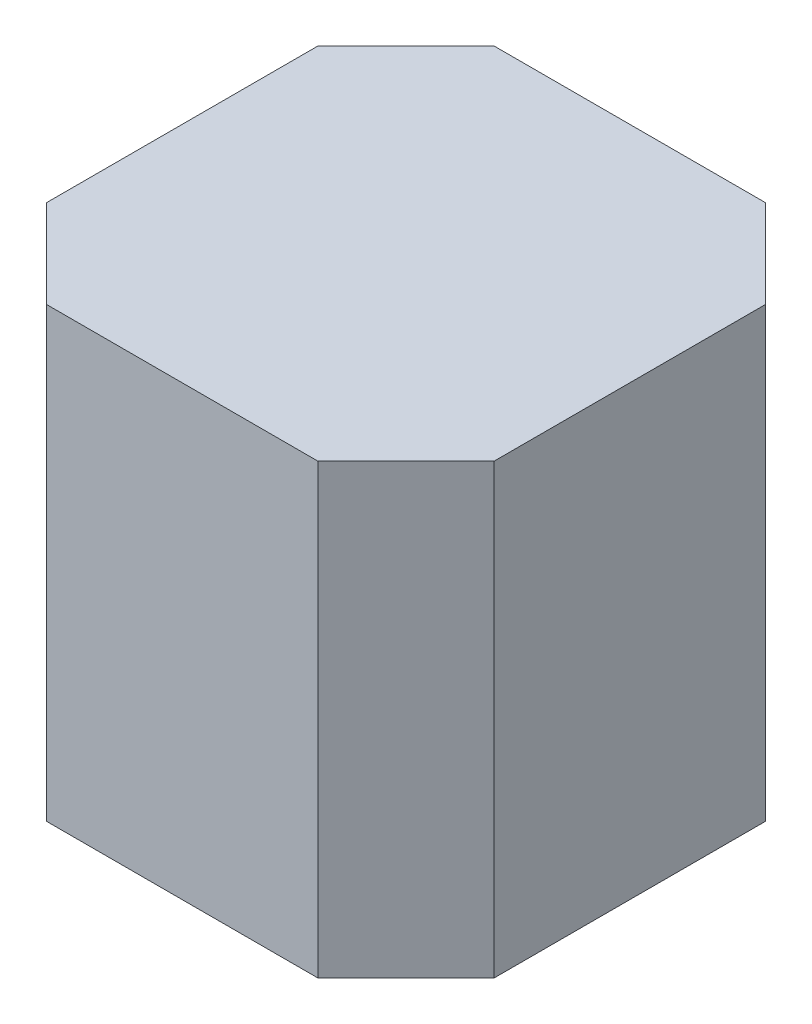
ISO-10303-21;
HEADER;
FILE_DESCRIPTION(('STEP AP214'),'2;1');
FILE_NAME('part.step','',(''),(''),'','','');
FILE_SCHEMA(('AUTOMOTIVE_DESIGN { 1 0 10303 214 1 1 1 1 }'));
ENDSEC;
DATA;
#1=APPLICATION_CONTEXT('core data for automotive mechanical design processes');
#2=APPLICATION_PROTOCOL_DEFINITION('international standard','automotive_design',2000,#1);
#3=PRODUCT_CONTEXT('',#1,'mechanical');
#4=PRODUCT('Part','Part','',(#3));
#5=PRODUCT_RELATED_PRODUCT_CATEGORY('part','',(#4));
#6=PRODUCT_DEFINITION_FORMATION('','',#4);
#7=PRODUCT_DEFINITION_CONTEXT('part definition',#1,'design');
#8=PRODUCT_DEFINITION('design','',#6,#7);
#9=PRODUCT_DEFINITION_SHAPE('','',#8);
#10=(LENGTH_UNIT() NAMED_UNIT(*) SI_UNIT(.MILLI.,.METRE.));
#11=(NAMED_UNIT(*) PLANE_ANGLE_UNIT() SI_UNIT($,.RADIAN.));
#12=(NAMED_UNIT(*) SI_UNIT($,.STERADIAN.) SOLID_ANGLE_UNIT());
#13=UNCERTAINTY_MEASURE_WITH_UNIT(LENGTH_MEASURE(1.E-05),#10,'distance_accuracy_value','');
#14=(GEOMETRIC_REPRESENTATION_CONTEXT(3) GLOBAL_UNCERTAINTY_ASSIGNED_CONTEXT((#13)) GLOBAL_UNIT_ASSIGNED_CONTEXT((#10,
#11,#12)) REPRESENTATION_CONTEXT('',''));
#15=CARTESIAN_POINT('',(0.,0.,0.));
#16=DIRECTION('',(0.,0.,1.));
#17=DIRECTION('',(1.,0.,0.));
#18=AXIS2_PLACEMENT_3D('',#15,#16,#17);
#19=CARTESIAN_POINT('',(2.54,0.,-1.27));
#20=DIRECTION('',(-1.,0.,0.));
#21=DIRECTION('',(0.,0.,1.));
#22=AXIS2_PLACEMENT_3D('',#19,#20,#21);
#23=PLANE('',#22);
#24=DIRECTION('',(0.,1.,0.));
#25=VECTOR('',#24,1.);
#26=CARTESIAN_POINT('',(2.54,0.,-0.77));
#27=LINE('',#26,#25);
#28=CARTESIAN_POINT('',(2.54,0.,-0.77));
#29=VERTEX_POINT('',#28);
#30=CARTESIAN_POINT('',(2.54,2.54,-0.77));
#31=VERTEX_POINT('',#30);
#32=EDGE_CURVE('E97',#29,#31,#27,.T.);
#33=ORIENTED_EDGE('',*,*,#32,.F.);
#34=DIRECTION('',(0.,0.,1.));
#35=VECTOR('',#34,1.);
#36=CARTESIAN_POINT('',(2.54,0.,-1.27));
#37=LINE('',#36,#35);
#38=CARTESIAN_POINT('',(2.54,0.,0.77));
#39=VERTEX_POINT('',#38);
#40=EDGE_CURVE('E83',#29,#39,#37,.T.);
#41=ORIENTED_EDGE('',*,*,#40,.T.);
#42=DIRECTION('',(0.,1.,0.));
#43=VECTOR('',#42,1.);
#44=CARTESIAN_POINT('',(2.54,0.,0.77));
#45=LINE('',#44,#43);
#46=CARTESIAN_POINT('',(2.54,2.54,0.77));
#47=VERTEX_POINT('',#46);
#48=EDGE_CURVE('E94',#47,#39,#45,.F.);
#49=ORIENTED_EDGE('',*,*,#48,.F.);
#50=DIRECTION('',(0.,0.,1.));
#51=VECTOR('',#50,1.);
#52=CARTESIAN_POINT('',(2.54,2.54,-1.27));
#53=LINE('',#52,#51);
#54=EDGE_CURVE('E20',#47,#31,#53,.F.);
#55=ORIENTED_EDGE('',*,*,#54,.T.);
#56=EDGE_LOOP('',(#33,#41,#49,#55));
#57=FACE_BOUND('',#56,.T.);
#58=ADVANCED_FACE('F17',(#57),#23,.T.);
#59=CARTESIAN_POINT('',(2.79,0.,1.02));
#60=DIRECTION('',(-0.707106781186548,0.,0.707106781186548));
#61=DIRECTION('',(0.707106781186548,0.,0.707106781186548));
#62=AXIS2_PLACEMENT_3D('',#59,#60,#61);
#63=PLANE('',#62);
#64=DIRECTION('',(0.707106781186548,0.,0.707106781186548));
#65=VECTOR('',#64,1.);
#66=CARTESIAN_POINT('',(2.79,2.54,1.02));
#67=LINE('',#66,#65);
#68=CARTESIAN_POINT('',(3.04,2.54,1.27));
#69=VERTEX_POINT('',#68);
#70=EDGE_CURVE('E91',#69,#47,#67,.F.);
#71=ORIENTED_EDGE('',*,*,#70,.T.);
#72=ORIENTED_EDGE('',*,*,#48,.T.);
#73=DIRECTION('',(0.707106781186548,0.,0.707106781186548));
#74=VECTOR('',#73,1.);
#75=CARTESIAN_POINT('',(2.79,0.,1.02));
#76=LINE('',#75,#74);
#77=CARTESIAN_POINT('',(3.04,0.,1.27));
#78=VERTEX_POINT('',#77);
#79=EDGE_CURVE('E80',#39,#78,#76,.T.);
#80=ORIENTED_EDGE('',*,*,#79,.T.);
#81=DIRECTION('',(0.,1.,0.));
#82=VECTOR('',#81,1.);
#83=CARTESIAN_POINT('',(3.04,0.,1.27));
#84=LINE('',#83,#82);
#85=EDGE_CURVE('E111',#69,#78,#84,.F.);
#86=ORIENTED_EDGE('',*,*,#85,.F.);
#87=EDGE_LOOP('',(#71,#72,#80,#86));
#88=FACE_BOUND('',#87,.T.);
#89=ADVANCED_FACE('F99',(#88),#63,.T.);
#90=CARTESIAN_POINT('',(2.79,0.,-1.02));
#91=DIRECTION('',(-0.707106781186548,0.,-0.707106781186548));
#92=DIRECTION('',(-0.707106781186548,0.,0.707106781186548));
#93=AXIS2_PLACEMENT_3D('',#90,#91,#92);
#94=PLANE('',#93);
#95=DIRECTION('',(-0.707106781186548,0.,0.707106781186548));
#96=VECTOR('',#95,1.);
#97=CARTESIAN_POINT('',(2.79,2.54,-1.02));
#98=LINE('',#97,#96);
#99=CARTESIAN_POINT('',(3.04,2.54,-1.27));
#100=VERTEX_POINT('',#99);
#101=EDGE_CURVE('E106',#31,#100,#98,.F.);
#102=ORIENTED_EDGE('',*,*,#101,.T.);
#103=DIRECTION('',(0.,1.,0.));
#104=VECTOR('',#103,1.);
#105=CARTESIAN_POINT('',(3.04,0.,-1.27));
#106=LINE('',#105,#104);
#107=CARTESIAN_POINT('',(3.04,0.,-1.27));
#108=VERTEX_POINT('',#107);
#109=EDGE_CURVE('E114',#108,#100,#106,.T.);
#110=ORIENTED_EDGE('',*,*,#109,.F.);
#111=DIRECTION('',(-0.707106781186548,0.,0.707106781186548));
#112=VECTOR('',#111,1.);
#113=CARTESIAN_POINT('',(2.79,0.,-1.02));
#114=LINE('',#113,#112);
#115=EDGE_CURVE('E100',#108,#29,#114,.T.);
#116=ORIENTED_EDGE('',*,*,#115,.T.);
#117=ORIENTED_EDGE('',*,*,#32,.T.);
#118=EDGE_LOOP('',(#102,#110,#116,#117));
#119=FACE_BOUND('',#118,.T.);
#120=ADVANCED_FACE('F158',(#119),#94,.T.);
#121=CARTESIAN_POINT('',(2.54,0.,1.27));
#122=DIRECTION('',(0.,0.,1.));
#123=DIRECTION('',(1.,0.,0.));
#124=AXIS2_PLACEMENT_3D('',#121,#122,#123);
#125=PLANE('',#124);
#126=ORIENTED_EDGE('',*,*,#85,.T.);
#127=DIRECTION('',(1.,0.,0.));
#128=VECTOR('',#127,1.);
#129=CARTESIAN_POINT('',(2.54,0.,1.27));
#130=LINE('',#129,#128);
#131=CARTESIAN_POINT('',(4.58,0.,1.27));
#132=VERTEX_POINT('',#131);
#133=EDGE_CURVE('E86',#78,#132,#130,.T.);
#134=ORIENTED_EDGE('',*,*,#133,.T.);
#135=DIRECTION('',(0.,1.,0.));
#136=VECTOR('',#135,1.);
#137=CARTESIAN_POINT('',(4.58,0.,1.27));
#138=LINE('',#137,#136);
#139=CARTESIAN_POINT('',(4.58,2.54,1.27));
#140=VERTEX_POINT('',#139);
#141=EDGE_CURVE('E120',#140,#132,#138,.F.);
#142=ORIENTED_EDGE('',*,*,#141,.F.);
#143=DIRECTION('',(1.,0.,0.));
#144=VECTOR('',#143,1.);
#145=CARTESIAN_POINT('',(2.54,2.54,1.27));
#146=LINE('',#145,#144);
#147=EDGE_CURVE('E108',#140,#69,#146,.F.);
#148=ORIENTED_EDGE('',*,*,#147,.T.);
#149=EDGE_LOOP('',(#126,#134,#142,#148));
#150=FACE_BOUND('',#149,.T.);
#151=ADVANCED_FACE('F163',(#150),#125,.T.);
#152=CARTESIAN_POINT('',(5.08,0.,-1.27));
#153=DIRECTION('',(0.,0.,-1.));
#154=DIRECTION('',(-1.,0.,0.));
#155=AXIS2_PLACEMENT_3D('',#152,#153,#154);
#156=PLANE('',#155);
#157=ORIENTED_EDGE('',*,*,#109,.T.);
#158=DIRECTION('',(-1.,0.,0.));
#159=VECTOR('',#158,1.);
#160=CARTESIAN_POINT('',(5.08,2.54,-1.27));
#161=LINE('',#160,#159);
#162=CARTESIAN_POINT('',(4.58,2.54,-1.27));
#163=VERTEX_POINT('',#162);
#164=EDGE_CURVE('E117',#100,#163,#161,.F.);
#165=ORIENTED_EDGE('',*,*,#164,.T.);
#166=DIRECTION('',(0.,1.,0.));
#167=VECTOR('',#166,1.);
#168=CARTESIAN_POINT('',(4.58,0.,-1.27));
#169=LINE('',#168,#167);
#170=CARTESIAN_POINT('',(4.58,0.,-1.27));
#171=VERTEX_POINT('',#170);
#172=EDGE_CURVE('E131',#171,#163,#169,.T.);
#173=ORIENTED_EDGE('',*,*,#172,.F.);
#174=DIRECTION('',(1.,0.,0.));
#175=VECTOR('',#174,1.);
#176=CARTESIAN_POINT('',(3.81,0.,-1.27));
#177=LINE('',#176,#175);
#178=EDGE_CURVE('E125',#171,#108,#177,.F.);
#179=ORIENTED_EDGE('',*,*,#178,.T.);
#180=EDGE_LOOP('',(#157,#165,#173,#179));
#181=FACE_BOUND('',#180,.T.);
#182=ADVANCED_FACE('F155',(#181),#156,.T.);
#183=CARTESIAN_POINT('',(4.83,0.,1.02));
#184=DIRECTION('',(0.707106781186548,0.,0.707106781186548));
#185=DIRECTION('',(0.707106781186548,0.,-0.707106781186548));
#186=AXIS2_PLACEMENT_3D('',#183,#184,#185);
#187=PLANE('',#186);
#188=DIRECTION('',(0.707106781186548,0.,-0.707106781186548));
#189=VECTOR('',#188,1.);
#190=CARTESIAN_POINT('',(4.83,2.54,1.02));
#191=LINE('',#190,#189);
#192=CARTESIAN_POINT('',(5.08,2.54,0.77));
#193=VERTEX_POINT('',#192);
#194=EDGE_CURVE('E34',#193,#140,#191,.F.);
#195=ORIENTED_EDGE('',*,*,#194,.T.);
#196=ORIENTED_EDGE('',*,*,#141,.T.);
#197=DIRECTION('',(0.707106781186548,0.,-0.707106781186547));
#198=VECTOR('',#197,1.);
#199=CARTESIAN_POINT('',(4.58,0.,1.27));
#200=LINE('',#199,#198);
#201=CARTESIAN_POINT('',(5.08,0.,0.77));
#202=VERTEX_POINT('',#201);
#203=EDGE_CURVE('E123',#132,#202,#200,.T.);
#204=ORIENTED_EDGE('',*,*,#203,.T.);
#205=DIRECTION('',(0.,1.,0.));
#206=VECTOR('',#205,1.);
#207=CARTESIAN_POINT('',(5.08,0.,0.77));
#208=LINE('',#207,#206);
#209=EDGE_CURVE('E136',#193,#202,#208,.F.);
#210=ORIENTED_EDGE('',*,*,#209,.F.);
#211=EDGE_LOOP('',(#195,#196,#204,#210));
#212=FACE_BOUND('',#211,.T.);
#213=ADVANCED_FACE('F160',(#212),#187,.T.);
#214=CARTESIAN_POINT('',(3.81,0.,0.));
#215=DIRECTION('',(0.,1.,0.));
#216=DIRECTION('',(0.,0.,1.));
#217=AXIS2_PLACEMENT_3D('',#214,#215,#216);
#218=PLANE('',#217);
#219=DIRECTION('',(-0.707106781186548,0.,-0.707106781186548));
#220=VECTOR('',#219,1.);
#221=CARTESIAN_POINT('',(4.83,0.,-1.02));
#222=LINE('',#221,#220);
#223=CARTESIAN_POINT('',(5.08,0.,-0.77));
#224=VERTEX_POINT('',#223);
#225=EDGE_CURVE('E128',#224,#171,#222,.T.);
#226=ORIENTED_EDGE('',*,*,#225,.F.);
#227=DIRECTION('',(0.,0.,-1.));
#228=VECTOR('',#227,1.);
#229=CARTESIAN_POINT('',(5.08,0.,1.27));
#230=LINE('',#229,#228);
#231=EDGE_CURVE('E139',#202,#224,#230,.T.);
#232=ORIENTED_EDGE('',*,*,#231,.F.);
#233=ORIENTED_EDGE('',*,*,#203,.F.);
#234=ORIENTED_EDGE('',*,*,#133,.F.);
#235=ORIENTED_EDGE('',*,*,#79,.F.);
#236=ORIENTED_EDGE('',*,*,#40,.F.);
#237=ORIENTED_EDGE('',*,*,#115,.F.);
#238=ORIENTED_EDGE('',*,*,#178,.F.);
#239=EDGE_LOOP('',(#226,#232,#233,#234,#235,#236,#237,#238));
#240=FACE_BOUND('',#239,.T.);
#241=ADVANCED_FACE('F82',(#240),#218,.F.);
#242=CARTESIAN_POINT('',(4.83,0.,-1.02));
#243=DIRECTION('',(0.707106781186548,0.,-0.707106781186548));
#244=DIRECTION('',(-0.707106781186548,0.,-0.707106781186548));
#245=AXIS2_PLACEMENT_3D('',#242,#243,#244);
#246=PLANE('',#245);
#247=DIRECTION('',(-0.707106781186548,0.,-0.707106781186548));
#248=VECTOR('',#247,1.);
#249=CARTESIAN_POINT('',(4.83,2.54,-1.02));
#250=LINE('',#249,#248);
#251=CARTESIAN_POINT('',(5.08,2.54,-0.77));
#252=VERTEX_POINT('',#251);
#253=EDGE_CURVE('E134',#163,#252,#250,.F.);
#254=ORIENTED_EDGE('',*,*,#253,.T.);
#255=DIRECTION('',(0.,1.,0.));
#256=VECTOR('',#255,1.);
#257=CARTESIAN_POINT('',(5.08,0.,-0.77));
#258=LINE('',#257,#256);
#259=EDGE_CURVE('E26',#224,#252,#258,.T.);
#260=ORIENTED_EDGE('',*,*,#259,.F.);
#261=ORIENTED_EDGE('',*,*,#225,.T.);
#262=ORIENTED_EDGE('',*,*,#172,.T.);
#263=EDGE_LOOP('',(#254,#260,#261,#262));
#264=FACE_BOUND('',#263,.T.);
#265=ADVANCED_FACE('F153',(#264),#246,.T.);
#266=CARTESIAN_POINT('',(5.08,0.,1.27));
#267=DIRECTION('',(1.,0.,0.));
#268=DIRECTION('',(0.,0.,-1.));
#269=AXIS2_PLACEMENT_3D('',#266,#267,#268);
#270=PLANE('',#269);
#271=ORIENTED_EDGE('',*,*,#259,.T.);
#272=DIRECTION('',(0.,0.,1.));
#273=VECTOR('',#272,1.);
#274=CARTESIAN_POINT('',(5.08,2.54,0.));
#275=LINE('',#274,#273);
#276=EDGE_CURVE('E11',#193,#252,#275,.F.);
#277=ORIENTED_EDGE('',*,*,#276,.F.);
#278=ORIENTED_EDGE('',*,*,#209,.T.);
#279=ORIENTED_EDGE('',*,*,#231,.T.);
#280=EDGE_LOOP('',(#271,#277,#278,#279));
#281=FACE_BOUND('',#280,.T.);
#282=ADVANCED_FACE('F146',(#281),#270,.T.);
#283=CARTESIAN_POINT('',(3.81,2.54,0.));
#284=DIRECTION('',(0.,1.,0.));
#285=DIRECTION('',(0.,0.,1.));
#286=AXIS2_PLACEMENT_3D('',#283,#284,#285);
#287=PLANE('',#286);
#288=ORIENTED_EDGE('',*,*,#194,.F.);
#289=ORIENTED_EDGE('',*,*,#276,.T.);
#290=ORIENTED_EDGE('',*,*,#253,.F.);
#291=ORIENTED_EDGE('',*,*,#164,.F.);
#292=ORIENTED_EDGE('',*,*,#101,.F.);
#293=ORIENTED_EDGE('',*,*,#54,.F.);
#294=ORIENTED_EDGE('',*,*,#70,.F.);
#295=ORIENTED_EDGE('',*,*,#147,.F.);
#296=EDGE_LOOP('',(#288,#289,#290,#291,#292,#293,#294,#295));
#297=FACE_BOUND('',#296,.T.);
#298=ADVANCED_FACE('F150',(#297),#287,.T.);
#299=CLOSED_SHELL('',(#58,#89,#120,#151,#182,#213,#241,#265,#282,#298));
#300=MANIFOLD_SOLID_BREP('B1',#299);
#301=ADVANCED_BREP_SHAPE_REPRESENTATION('',(#18,#300),#14);
#302=SHAPE_DEFINITION_REPRESENTATION(#9,#301);
ENDSEC;
END-ISO-10303-21;
